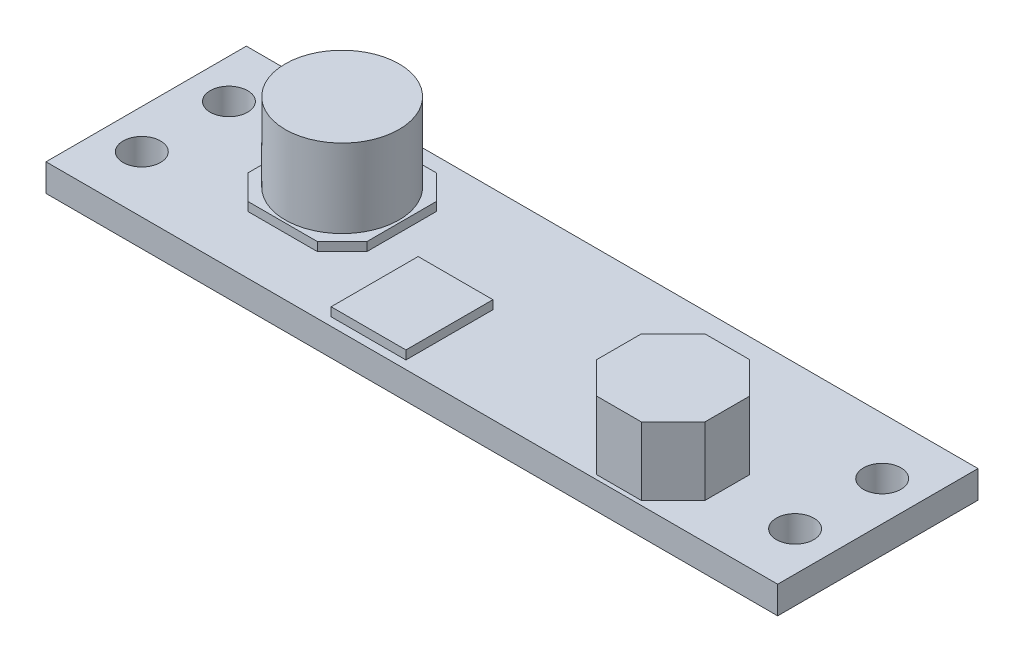
ISO-10303-21;
HEADER;
FILE_DESCRIPTION(('STEP AP214'),'2;1');
FILE_NAME('part.step','',(''),(''),'','','');
FILE_SCHEMA(('AUTOMOTIVE_DESIGN { 1 0 10303 214 1 1 1 1 }'));
ENDSEC;
DATA;
#1=APPLICATION_CONTEXT('core data for automotive mechanical design processes');
#2=APPLICATION_PROTOCOL_DEFINITION('international standard','automotive_design',2000,#1);
#3=PRODUCT_CONTEXT('',#1,'mechanical');
#4=PRODUCT('Part','Part','',(#3));
#5=PRODUCT_RELATED_PRODUCT_CATEGORY('part','',(#4));
#6=PRODUCT_DEFINITION_FORMATION('','',#4);
#7=PRODUCT_DEFINITION_CONTEXT('part definition',#1,'design');
#8=PRODUCT_DEFINITION('design','',#6,#7);
#9=PRODUCT_DEFINITION_SHAPE('','',#8);
#10=(LENGTH_UNIT() NAMED_UNIT(*) SI_UNIT(.MILLI.,.METRE.));
#11=(NAMED_UNIT(*) PLANE_ANGLE_UNIT() SI_UNIT($,.RADIAN.));
#12=(NAMED_UNIT(*) SI_UNIT($,.STERADIAN.) SOLID_ANGLE_UNIT());
#13=UNCERTAINTY_MEASURE_WITH_UNIT(LENGTH_MEASURE(1.E-05),#10,'distance_accuracy_value','');
#14=(GEOMETRIC_REPRESENTATION_CONTEXT(3) GLOBAL_UNCERTAINTY_ASSIGNED_CONTEXT((#13)) GLOBAL_UNIT_ASSIGNED_CONTEXT((#10,
#11,#12)) REPRESENTATION_CONTEXT('',''));
#15=CARTESIAN_POINT('',(0.,0.,0.));
#16=DIRECTION('',(0.,0.,1.));
#17=DIRECTION('',(1.,0.,0.));
#18=AXIS2_PLACEMENT_3D('',#15,#16,#17);
#19=CARTESIAN_POINT('',(21.336,1.6002,-5.842));
#20=DIRECTION('',(0.,-1.,0.));
#21=DIRECTION('',(0.,0.,-1.));
#22=AXIS2_PLACEMENT_3D('',#19,#20,#21);
#23=PLANE('',#22);
#24=DIRECTION('',(0.707106781186548,0.,-0.707106781186547));
#25=VECTOR('',#24,1.);
#26=CARTESIAN_POINT('',(-7.44094847732413,1.6002,1.02877931249168));
#27=LINE('',#26,#25);
#28=CARTESIAN_POINT('',(-8.87778945669519,1.6002,2.46562029186274));
#29=VERTEX_POINT('',#28);
#30=CARTESIAN_POINT('',(-7.44094847732413,1.6002,1.02877931249168));
#31=VERTEX_POINT('',#30);
#32=EDGE_CURVE('E219',#29,#31,#27,.T.);
#33=ORIENTED_EDGE('',*,*,#32,.F.);
#34=DIRECTION('',(1.,0.,0.));
#35=VECTOR('',#34,1.);
#36=CARTESIAN_POINT('',(-8.87778945669519,1.6002,2.46562029186274));
#37=LINE('',#36,#35);
#38=CARTESIAN_POINT('',(-12.9417894566952,1.6002,2.46562029186274));
#39=VERTEX_POINT('',#38);
#40=EDGE_CURVE('E229',#39,#29,#37,.T.);
#41=ORIENTED_EDGE('',*,*,#40,.F.);
#42=DIRECTION('',(0.707106781186548,0.,0.707106781186548));
#43=VECTOR('',#42,1.);
#44=CARTESIAN_POINT('',(-12.9417894566952,1.6002,2.46562029186274));
#45=LINE('',#44,#43);
#46=CARTESIAN_POINT('',(-14.3786304360663,1.6002,1.02877931249169));
#47=VERTEX_POINT('',#46);
#48=EDGE_CURVE('E261',#47,#39,#45,.T.);
#49=ORIENTED_EDGE('',*,*,#48,.F.);
#50=DIRECTION('',(0.,0.,1.));
#51=VECTOR('',#50,1.);
#52=CARTESIAN_POINT('',(-14.3786304360663,1.6002,1.02877931249168));
#53=LINE('',#52,#51);
#54=CARTESIAN_POINT('',(-14.3786304360663,1.6002,-3.03522068750832));
#55=VERTEX_POINT('',#54);
#56=EDGE_CURVE('E258',#55,#47,#53,.T.);
#57=ORIENTED_EDGE('',*,*,#56,.F.);
#58=DIRECTION('',(-0.707106781186548,0.,0.707106781186547));
#59=VECTOR('',#58,1.);
#60=CARTESIAN_POINT('',(-14.3786304360663,1.6002,-3.03522068750832));
#61=LINE('',#60,#59);
#62=CARTESIAN_POINT('',(-12.9417894566952,1.6002,-4.47206166687938));
#63=VERTEX_POINT('',#62);
#64=EDGE_CURVE('E255',#63,#55,#61,.T.);
#65=ORIENTED_EDGE('',*,*,#64,.F.);
#66=DIRECTION('',(-1.,0.,0.));
#67=VECTOR('',#66,1.);
#68=CARTESIAN_POINT('',(-12.9417894566952,1.6002,-4.47206166687939));
#69=LINE('',#68,#67);
#70=CARTESIAN_POINT('',(-8.87778945669519,1.6002,-4.47206166687939));
#71=VERTEX_POINT('',#70);
#72=EDGE_CURVE('E252',#71,#63,#69,.T.);
#73=ORIENTED_EDGE('',*,*,#72,.F.);
#74=DIRECTION('',(-0.707106781186547,0.,-0.707106781186548));
#75=VECTOR('',#74,1.);
#76=CARTESIAN_POINT('',(-7.44094847732413,1.6002,-3.03522068750832));
#77=LINE('',#76,#75);
#78=CARTESIAN_POINT('',(-7.44094847732413,1.6002,-3.03522068750832));
#79=VERTEX_POINT('',#78);
#80=EDGE_CURVE('E249',#79,#71,#77,.T.);
#81=ORIENTED_EDGE('',*,*,#80,.F.);
#82=DIRECTION('',(0.,0.,-1.));
#83=VECTOR('',#82,1.);
#84=CARTESIAN_POINT('',(-7.44094847732413,1.6002,1.02877931249168));
#85=LINE('',#84,#83);
#86=EDGE_CURVE('E246',#31,#79,#85,.T.);
#87=ORIENTED_EDGE('',*,*,#86,.F.);
#88=EDGE_LOOP('',(#33,#41,#49,#57,#65,#73,#81,#87));
#89=FACE_BOUND('',#88,.T.);
#90=CARTESIAN_POINT('',(19.05,1.6002,2.54));
#91=DIRECTION('',(0.,1.,0.));
#92=DIRECTION('',(0.,0.,1.));
#93=AXIS2_PLACEMENT_3D('',#90,#91,#92);
#94=CIRCLE('',#93,1.0922);
#95=CARTESIAN_POINT('',(19.05,1.6002,3.6322));
#96=VERTEX_POINT('',#95);
#97=EDGE_CURVE('E323',#96,#96,#94,.T.);
#98=ORIENTED_EDGE('',*,*,#97,.F.);
#99=EDGE_LOOP('',(#98));
#100=FACE_BOUND('',#99,.T.);
#101=CARTESIAN_POINT('',(-19.05,1.6002,2.54));
#102=DIRECTION('',(0.,1.,0.));
#103=DIRECTION('',(0.,0.,1.));
#104=AXIS2_PLACEMENT_3D('',#101,#102,#103);
#105=CIRCLE('',#104,1.0922);
#106=CARTESIAN_POINT('',(-19.05,1.6002,3.6322));
#107=VERTEX_POINT('',#106);
#108=EDGE_CURVE('E335',#107,#107,#105,.T.);
#109=ORIENTED_EDGE('',*,*,#108,.F.);
#110=EDGE_LOOP('',(#109));
#111=FACE_BOUND('',#110,.T.);
#112=DIRECTION('',(0.,0.,-1.));
#113=VECTOR('',#112,1.);
#114=CARTESIAN_POINT('',(21.336,1.6002,5.842));
#115=LINE('',#114,#113);
#116=CARTESIAN_POINT('',(21.336,1.6002,5.842));
#117=VERTEX_POINT('',#116);
#118=CARTESIAN_POINT('',(21.336,1.6002,-5.842));
#119=VERTEX_POINT('',#118);
#120=EDGE_CURVE('E347',#117,#119,#115,.T.);
#121=ORIENTED_EDGE('',*,*,#120,.T.);
#122=DIRECTION('',(-1.,0.,0.));
#123=VECTOR('',#122,1.);
#124=CARTESIAN_POINT('',(-21.336,1.6002,-5.842));
#125=LINE('',#124,#123);
#126=CARTESIAN_POINT('',(-21.336,1.6002,-5.842));
#127=VERTEX_POINT('',#126);
#128=EDGE_CURVE('E350',#119,#127,#125,.T.);
#129=ORIENTED_EDGE('',*,*,#128,.T.);
#130=DIRECTION('',(0.,0.,1.));
#131=VECTOR('',#130,1.);
#132=CARTESIAN_POINT('',(-21.336,1.6002,5.842));
#133=LINE('',#132,#131);
#134=CARTESIAN_POINT('',(-21.336,1.6002,5.842));
#135=VERTEX_POINT('',#134);
#136=EDGE_CURVE('E353',#127,#135,#133,.T.);
#137=ORIENTED_EDGE('',*,*,#136,.T.);
#138=DIRECTION('',(1.,0.,0.));
#139=VECTOR('',#138,1.);
#140=CARTESIAN_POINT('',(-21.336,1.6002,5.842));
#141=LINE('',#140,#139);
#142=EDGE_CURVE('E355',#135,#117,#141,.T.);
#143=ORIENTED_EDGE('',*,*,#142,.T.);
#144=EDGE_LOOP('',(#121,#129,#137,#143));
#145=FACE_BOUND('',#144,.T.);
#146=CARTESIAN_POINT('',(-19.05,1.6002,-2.54));
#147=DIRECTION('',(0.,1.,0.));
#148=DIRECTION('',(0.,0.,1.));
#149=AXIS2_PLACEMENT_3D('',#146,#147,#148);
#150=CIRCLE('',#149,1.0922);
#151=CARTESIAN_POINT('',(-19.05,1.6002,-1.4478));
#152=VERTEX_POINT('',#151);
#153=EDGE_CURVE('E341',#152,#152,#150,.T.);
#154=ORIENTED_EDGE('',*,*,#153,.F.);
#155=EDGE_LOOP('',(#154));
#156=FACE_BOUND('',#155,.T.);
#157=CARTESIAN_POINT('',(19.05,1.6002,-2.54));
#158=DIRECTION('',(0.,1.,0.));
#159=DIRECTION('',(0.,0.,1.));
#160=AXIS2_PLACEMENT_3D('',#157,#158,#159);
#161=CIRCLE('',#160,1.0922);
#162=CARTESIAN_POINT('',(19.05,1.6002,-1.4478));
#163=VERTEX_POINT('',#162);
#164=EDGE_CURVE('E329',#163,#163,#161,.T.);
#165=ORIENTED_EDGE('',*,*,#164,.F.);
#166=EDGE_LOOP('',(#165));
#167=FACE_BOUND('',#166,.T.);
#168=DIRECTION('',(0.,0.,-1.));
#169=VECTOR('',#168,1.);
#170=CARTESIAN_POINT('',(-0.829899240670784,1.6002,5.35736625431582));
#171=LINE('',#170,#169);
#172=CARTESIAN_POINT('',(-0.829899240670784,1.6002,5.35736625431582));
#173=VERTEX_POINT('',#172);
#174=CARTESIAN_POINT('',(-0.829899240670784,1.6002,0.283124966983905));
#175=VERTEX_POINT('',#174);
#176=EDGE_CURVE('E289',#173,#175,#171,.T.);
#177=ORIENTED_EDGE('',*,*,#176,.F.);
#178=DIRECTION('',(1.,0.,0.));
#179=VECTOR('',#178,1.);
#180=CARTESIAN_POINT('',(-0.829899240670784,1.6002,5.35736625431582));
#181=LINE('',#180,#179);
#182=CARTESIAN_POINT('',(-5.19072849414215,1.6002,5.35736625431582));
#183=VERTEX_POINT('',#182);
#184=EDGE_CURVE('E294',#183,#173,#181,.T.);
#185=ORIENTED_EDGE('',*,*,#184,.F.);
#186=DIRECTION('',(0.,0.,1.));
#187=VECTOR('',#186,1.);
#188=CARTESIAN_POINT('',(-5.19072849414215,1.6002,5.35736625431582));
#189=LINE('',#188,#187);
#190=CARTESIAN_POINT('',(-5.19072849414215,1.6002,0.283124966983905));
#191=VERTEX_POINT('',#190);
#192=EDGE_CURVE('E306',#191,#183,#189,.T.);
#193=ORIENTED_EDGE('',*,*,#192,.F.);
#194=DIRECTION('',(-1.,0.,0.));
#195=VECTOR('',#194,1.);
#196=CARTESIAN_POINT('',(-0.829899240670784,1.6002,0.283124966983905));
#197=LINE('',#196,#195);
#198=EDGE_CURVE('E303',#175,#191,#197,.T.);
#199=ORIENTED_EDGE('',*,*,#198,.F.);
#200=EDGE_LOOP('',(#177,#185,#193,#199));
#201=FACE_BOUND('',#200,.T.);
#202=DIRECTION('',(0.707106781186547,0.,-0.707106781186548));
#203=VECTOR('',#202,1.);
#204=CARTESIAN_POINT('',(13.1403500317624,1.6002,5.58754447328604));
#205=LINE('',#204,#203);
#206=CARTESIAN_POINT('',(13.1403500317624,1.6002,5.58754447328604));
#207=VERTEX_POINT('',#206);
#208=CARTESIAN_POINT('',(14.986,1.6002,3.74189450504848));
#209=VERTEX_POINT('',#208);
#210=EDGE_CURVE('E215',#207,#209,#205,.T.);
#211=ORIENTED_EDGE('',*,*,#210,.F.);
#212=DIRECTION('',(1.,0.,0.));
#213=VECTOR('',#212,1.);
#214=CARTESIAN_POINT('',(10.5302068152874,1.6002,5.58754447328604));
#215=LINE('',#214,#213);
#216=CARTESIAN_POINT('',(10.5302068152874,1.6002,5.58754447328604));
#217=VERTEX_POINT('',#216);
#218=EDGE_CURVE('E212',#217,#207,#215,.T.);
#219=ORIENTED_EDGE('',*,*,#218,.F.);
#220=DIRECTION('',(0.707106781186548,0.,0.707106781186547));
#221=VECTOR('',#220,1.);
#222=CARTESIAN_POINT('',(8.68455684704985,1.6002,3.74189450504848));
#223=LINE('',#222,#221);
#224=CARTESIAN_POINT('',(8.68455684704985,1.6002,3.74189450504848));
#225=VERTEX_POINT('',#224);
#226=EDGE_CURVE('E412',#225,#217,#223,.T.);
#227=ORIENTED_EDGE('',*,*,#226,.F.);
#228=DIRECTION('',(0.,0.,1.));
#229=VECTOR('',#228,1.);
#230=CARTESIAN_POINT('',(8.68455684704985,1.6002,1.13175128857345));
#231=LINE('',#230,#229);
#232=CARTESIAN_POINT('',(8.68455684704985,1.6002,1.13175128857345));
#233=VERTEX_POINT('',#232);
#234=EDGE_CURVE('E446',#233,#225,#231,.T.);
#235=ORIENTED_EDGE('',*,*,#234,.F.);
#236=DIRECTION('',(-0.707106781186547,0.,0.707106781186548));
#237=VECTOR('',#236,1.);
#238=CARTESIAN_POINT('',(10.5302068152874,1.6002,-0.713898679664109));
#239=LINE('',#238,#237);
#240=CARTESIAN_POINT('',(10.5302068152874,1.6002,-0.713898679664109));
#241=VERTEX_POINT('',#240);
#242=EDGE_CURVE('E440',#241,#233,#239,.T.);
#243=ORIENTED_EDGE('',*,*,#242,.F.);
#244=DIRECTION('',(-1.,0.,0.));
#245=VECTOR('',#244,1.);
#246=CARTESIAN_POINT('',(13.1403500317624,1.6002,-0.71389867966411));
#247=LINE('',#246,#245);
#248=CARTESIAN_POINT('',(13.1403500317624,1.6002,-0.71389867966411));
#249=VERTEX_POINT('',#248);
#250=EDGE_CURVE('E435',#249,#241,#247,.T.);
#251=ORIENTED_EDGE('',*,*,#250,.F.);
#252=DIRECTION('',(-0.707106781186548,0.,-0.707106781186547));
#253=VECTOR('',#252,1.);
#254=CARTESIAN_POINT('',(14.986,1.6002,1.13175128857346));
#255=LINE('',#254,#253);
#256=CARTESIAN_POINT('',(14.986,1.6002,1.13175128857346));
#257=VERTEX_POINT('',#256);
#258=EDGE_CURVE('E54',#257,#249,#255,.T.);
#259=ORIENTED_EDGE('',*,*,#258,.F.);
#260=DIRECTION('',(0.,0.,-1.));
#261=VECTOR('',#260,1.);
#262=CARTESIAN_POINT('',(14.986,1.6002,3.74189450504848));
#263=LINE('',#262,#261);
#264=EDGE_CURVE('E49',#209,#257,#263,.T.);
#265=ORIENTED_EDGE('',*,*,#264,.F.);
#266=EDGE_LOOP('',(#211,#219,#227,#235,#243,#251,#259,#265));
#267=FACE_BOUND('',#266,.T.);
#268=ADVANCED_FACE('F34',(#89,#100,#111,#145,#156,#167,#201,#267),#23,.F.);
#269=CARTESIAN_POINT('',(-10.9097894566952,2.1082,4.49762029186274));
#270=DIRECTION('',(0.,-1.,0.));
#271=DIRECTION('',(0.,0.,-1.));
#272=AXIS2_PLACEMENT_3D('',#269,#270,#271);
#273=PLANE('',#272);
#274=DIRECTION('',(0.707106781186548,0.,-0.707106781186547));
#275=VECTOR('',#274,1.);
#276=CARTESIAN_POINT('',(-7.44094847732413,2.1082,1.02877931249168));
#277=LINE('',#276,#275);
#278=CARTESIAN_POINT('',(-8.87778945669519,2.1082,2.46562029186274));
#279=VERTEX_POINT('',#278);
#280=CARTESIAN_POINT('',(-7.44094847732413,2.1082,1.02877931249168));
#281=VERTEX_POINT('',#280);
#282=EDGE_CURVE('E225',#279,#281,#277,.T.);
#283=ORIENTED_EDGE('',*,*,#282,.T.);
#284=DIRECTION('',(0.,0.,-1.));
#285=VECTOR('',#284,1.);
#286=CARTESIAN_POINT('',(-7.44094847732413,2.1082,1.02877931249168));
#287=LINE('',#286,#285);
#288=CARTESIAN_POINT('',(-7.44094847732413,2.1082,-3.03522068750832));
#289=VERTEX_POINT('',#288);
#290=EDGE_CURVE('E228',#281,#289,#287,.T.);
#291=ORIENTED_EDGE('',*,*,#290,.T.);
#292=DIRECTION('',(-0.707106781186547,0.,-0.707106781186548));
#293=VECTOR('',#292,1.);
#294=CARTESIAN_POINT('',(-7.44094847732413,2.1082,-3.03522068750832));
#295=LINE('',#294,#293);
#296=CARTESIAN_POINT('',(-8.87778945669519,2.1082,-4.47206166687939));
#297=VERTEX_POINT('',#296);
#298=EDGE_CURVE('E231',#289,#297,#295,.T.);
#299=ORIENTED_EDGE('',*,*,#298,.T.);
#300=DIRECTION('',(-1.,0.,0.));
#301=VECTOR('',#300,1.);
#302=CARTESIAN_POINT('',(-12.9417894566952,2.1082,-4.47206166687939));
#303=LINE('',#302,#301);
#304=CARTESIAN_POINT('',(-12.9417894566952,2.1082,-4.47206166687939));
#305=VERTEX_POINT('',#304);
#306=EDGE_CURVE('E233',#297,#305,#303,.T.);
#307=ORIENTED_EDGE('',*,*,#306,.T.);
#308=DIRECTION('',(-0.707106781186548,0.,0.707106781186547));
#309=VECTOR('',#308,1.);
#310=CARTESIAN_POINT('',(-14.3786304360663,2.1082,-3.03522068750832));
#311=LINE('',#310,#309);
#312=CARTESIAN_POINT('',(-14.3786304360663,2.1082,-3.03522068750832));
#313=VERTEX_POINT('',#312);
#314=EDGE_CURVE('E235',#305,#313,#311,.T.);
#315=ORIENTED_EDGE('',*,*,#314,.T.);
#316=DIRECTION('',(0.,0.,1.));
#317=VECTOR('',#316,1.);
#318=CARTESIAN_POINT('',(-14.3786304360663,2.1082,1.02877931249168));
#319=LINE('',#318,#317);
#320=CARTESIAN_POINT('',(-14.3786304360663,2.1082,1.02877931249168));
#321=VERTEX_POINT('',#320);
#322=EDGE_CURVE('E237',#313,#321,#319,.T.);
#323=ORIENTED_EDGE('',*,*,#322,.T.);
#324=DIRECTION('',(0.707106781186548,0.,0.707106781186548));
#325=VECTOR('',#324,1.);
#326=CARTESIAN_POINT('',(-12.9417894566952,2.1082,2.46562029186274));
#327=LINE('',#326,#325);
#328=CARTESIAN_POINT('',(-12.9417894566952,2.1082,2.46562029186274));
#329=VERTEX_POINT('',#328);
#330=EDGE_CURVE('E239',#321,#329,#327,.T.);
#331=ORIENTED_EDGE('',*,*,#330,.T.);
#332=DIRECTION('',(1.,0.,0.));
#333=VECTOR('',#332,1.);
#334=CARTESIAN_POINT('',(-8.87778945669519,2.1082,2.46562029186274));
#335=LINE('',#334,#333);
#336=EDGE_CURVE('E241',#329,#279,#335,.T.);
#337=ORIENTED_EDGE('',*,*,#336,.T.);
#338=EDGE_LOOP('',(#283,#291,#299,#307,#315,#323,#331,#337));
#339=FACE_BOUND('',#338,.T.);
#340=CARTESIAN_POINT('',(-10.9097894566952,2.1082,-1.00322068750832));
#341=DIRECTION('',(0.,-1.,0.));
#342=DIRECTION('',(0.,0.,-1.));
#343=AXIS2_PLACEMENT_3D('',#340,#341,#342);
#344=CIRCLE('',#343,3.31832506713628);
#345=CARTESIAN_POINT('',(-10.9097894566952,2.1082,-4.3215457546446));
#346=VERTEX_POINT('',#345);
#347=EDGE_CURVE('E11',#346,#346,#344,.F.);
#348=ORIENTED_EDGE('',*,*,#347,.F.);
#349=EDGE_LOOP('',(#348));
#350=FACE_BOUND('',#349,.T.);
#351=ADVANCED_FACE('F396',(#339,#350),#273,.F.);
#352=CARTESIAN_POINT('',(21.336,0.,-5.842));
#353=DIRECTION('',(0.,-1.,0.));
#354=DIRECTION('',(0.,0.,-1.));
#355=AXIS2_PLACEMENT_3D('',#352,#353,#354);
#356=PLANE('',#355);
#357=CARTESIAN_POINT('',(19.05,0.,-2.54));
#358=DIRECTION('',(0.,1.,0.));
#359=DIRECTION('',(0.,0.,1.));
#360=AXIS2_PLACEMENT_3D('',#357,#358,#359);
#361=CIRCLE('',#360,1.0922);
#362=CARTESIAN_POINT('',(19.05,0.,-1.4478));
#363=VERTEX_POINT('',#362);
#364=EDGE_CURVE('E326',#363,#363,#361,.T.);
#365=ORIENTED_EDGE('',*,*,#364,.T.);
#366=EDGE_LOOP('',(#365));
#367=FACE_BOUND('',#366,.T.);
#368=CARTESIAN_POINT('',(-19.05,0.,-2.54));
#369=DIRECTION('',(0.,1.,0.));
#370=DIRECTION('',(0.,0.,1.));
#371=AXIS2_PLACEMENT_3D('',#368,#369,#370);
#372=CIRCLE('',#371,1.0922);
#373=CARTESIAN_POINT('',(-19.05,0.,-1.4478));
#374=VERTEX_POINT('',#373);
#375=EDGE_CURVE('E338',#374,#374,#372,.T.);
#376=ORIENTED_EDGE('',*,*,#375,.T.);
#377=EDGE_LOOP('',(#376));
#378=FACE_BOUND('',#377,.T.);
#379=DIRECTION('',(0.,0.,-1.));
#380=VECTOR('',#379,1.);
#381=CARTESIAN_POINT('',(21.336,0.,5.842));
#382=LINE('',#381,#380);
#383=CARTESIAN_POINT('',(21.336,0.,5.842));
#384=VERTEX_POINT('',#383);
#385=CARTESIAN_POINT('',(21.336,0.,-5.842));
#386=VERTEX_POINT('',#385);
#387=EDGE_CURVE('E344',#384,#386,#382,.T.);
#388=ORIENTED_EDGE('',*,*,#387,.F.);
#389=DIRECTION('',(1.,0.,0.));
#390=VECTOR('',#389,1.);
#391=CARTESIAN_POINT('',(-21.336,0.,5.842));
#392=LINE('',#391,#390);
#393=CARTESIAN_POINT('',(-21.336,0.,5.842));
#394=VERTEX_POINT('',#393);
#395=EDGE_CURVE('E351',#394,#384,#392,.T.);
#396=ORIENTED_EDGE('',*,*,#395,.F.);
#397=DIRECTION('',(0.,0.,1.));
#398=VECTOR('',#397,1.);
#399=CARTESIAN_POINT('',(-21.336,0.,5.842));
#400=LINE('',#399,#398);
#401=CARTESIAN_POINT('',(-21.336,0.,-5.842));
#402=VERTEX_POINT('',#401);
#403=EDGE_CURVE('E362',#402,#394,#400,.T.);
#404=ORIENTED_EDGE('',*,*,#403,.F.);
#405=DIRECTION('',(-1.,0.,0.));
#406=VECTOR('',#405,1.);
#407=CARTESIAN_POINT('',(-21.336,0.,-5.842));
#408=LINE('',#407,#406);
#409=EDGE_CURVE('E360',#386,#402,#408,.T.);
#410=ORIENTED_EDGE('',*,*,#409,.F.);
#411=EDGE_LOOP('',(#388,#396,#404,#410));
#412=FACE_BOUND('',#411,.T.);
#413=CARTESIAN_POINT('',(-19.05,0.,2.54));
#414=DIRECTION('',(0.,1.,0.));
#415=DIRECTION('',(0.,0.,1.));
#416=AXIS2_PLACEMENT_3D('',#413,#414,#415);
#417=CIRCLE('',#416,1.0922);
#418=CARTESIAN_POINT('',(-19.05,0.,3.6322));
#419=VERTEX_POINT('',#418);
#420=EDGE_CURVE('E332',#419,#419,#417,.T.);
#421=ORIENTED_EDGE('',*,*,#420,.T.);
#422=EDGE_LOOP('',(#421));
#423=FACE_BOUND('',#422,.T.);
#424=CARTESIAN_POINT('',(19.05,0.,2.54));
#425=DIRECTION('',(0.,1.,0.));
#426=DIRECTION('',(0.,0.,1.));
#427=AXIS2_PLACEMENT_3D('',#424,#425,#426);
#428=CIRCLE('',#427,1.0922);
#429=CARTESIAN_POINT('',(19.05,0.,3.6322));
#430=VERTEX_POINT('',#429);
#431=EDGE_CURVE('E322',#430,#430,#428,.T.);
#432=ORIENTED_EDGE('',*,*,#431,.T.);
#433=EDGE_LOOP('',(#432));
#434=FACE_BOUND('',#433,.T.);
#435=ADVANCED_FACE('F383',(#367,#378,#412,#423,#434),#356,.T.);
#436=CARTESIAN_POINT('',(21.336,1.6002,5.842));
#437=DIRECTION('',(-1.,0.,0.));
#438=DIRECTION('',(0.,0.,1.));
#439=AXIS2_PLACEMENT_3D('',#436,#437,#438);
#440=PLANE('',#439);
#441=ORIENTED_EDGE('',*,*,#387,.T.);
#442=DIRECTION('',(0.,-1.,0.));
#443=VECTOR('',#442,1.);
#444=CARTESIAN_POINT('',(21.336,1.6002,-5.842));
#445=LINE('',#444,#443);
#446=EDGE_CURVE('E42',#119,#386,#445,.T.);
#447=ORIENTED_EDGE('',*,*,#446,.F.);
#448=ORIENTED_EDGE('',*,*,#120,.F.);
#449=DIRECTION('',(0.,-1.,0.));
#450=VECTOR('',#449,1.);
#451=CARTESIAN_POINT('',(21.336,1.6002,5.842));
#452=LINE('',#451,#450);
#453=EDGE_CURVE('E357',#117,#384,#452,.T.);
#454=ORIENTED_EDGE('',*,*,#453,.T.);
#455=EDGE_LOOP('',(#441,#447,#448,#454));
#456=FACE_BOUND('',#455,.T.);
#457=ADVANCED_FACE('F36',(#456),#440,.F.);
#458=CARTESIAN_POINT('',(-21.336,1.6002,-5.842));
#459=DIRECTION('',(0.,0.,1.));
#460=DIRECTION('',(1.,0.,0.));
#461=AXIS2_PLACEMENT_3D('',#458,#459,#460);
#462=PLANE('',#461);
#463=ORIENTED_EDGE('',*,*,#409,.T.);
#464=DIRECTION('',(0.,-1.,0.));
#465=VECTOR('',#464,1.);
#466=CARTESIAN_POINT('',(-21.336,1.6002,-5.842));
#467=LINE('',#466,#465);
#468=EDGE_CURVE('E370',#127,#402,#467,.T.);
#469=ORIENTED_EDGE('',*,*,#468,.F.);
#470=ORIENTED_EDGE('',*,*,#128,.F.);
#471=ORIENTED_EDGE('',*,*,#446,.T.);
#472=EDGE_LOOP('',(#463,#469,#470,#471));
#473=FACE_BOUND('',#472,.T.);
#474=ADVANCED_FACE('F375',(#473),#462,.F.);
#475=CARTESIAN_POINT('',(-21.336,1.6002,5.842));
#476=DIRECTION('',(1.,0.,0.));
#477=DIRECTION('',(0.,0.,-1.));
#478=AXIS2_PLACEMENT_3D('',#475,#476,#477);
#479=PLANE('',#478);
#480=ORIENTED_EDGE('',*,*,#403,.T.);
#481=DIRECTION('',(0.,-1.,0.));
#482=VECTOR('',#481,1.);
#483=CARTESIAN_POINT('',(-21.336,1.6002,5.842));
#484=LINE('',#483,#482);
#485=EDGE_CURVE('E367',#135,#394,#484,.T.);
#486=ORIENTED_EDGE('',*,*,#485,.F.);
#487=ORIENTED_EDGE('',*,*,#136,.F.);
#488=ORIENTED_EDGE('',*,*,#468,.T.);
#489=EDGE_LOOP('',(#480,#486,#487,#488));
#490=FACE_BOUND('',#489,.T.);
#491=ADVANCED_FACE('F388',(#490),#479,.F.);
#492=CARTESIAN_POINT('',(-21.336,1.6002,5.842));
#493=DIRECTION('',(0.,0.,-1.));
#494=DIRECTION('',(-1.,0.,0.));
#495=AXIS2_PLACEMENT_3D('',#492,#493,#494);
#496=PLANE('',#495);
#497=ORIENTED_EDGE('',*,*,#395,.T.);
#498=ORIENTED_EDGE('',*,*,#453,.F.);
#499=ORIENTED_EDGE('',*,*,#142,.F.);
#500=ORIENTED_EDGE('',*,*,#485,.T.);
#501=EDGE_LOOP('',(#497,#498,#499,#500));
#502=FACE_BOUND('',#501,.T.);
#503=ADVANCED_FACE('F392',(#502),#496,.F.);
#504=CARTESIAN_POINT('',(-19.05,1.6002,-2.54));
#505=DIRECTION('',(0.,-1.,0.));
#506=DIRECTION('',(0.,0.,-1.));
#507=AXIS2_PLACEMENT_3D('',#504,#505,#506);
#508=CYLINDRICAL_SURFACE('',#507,1.0922);
#509=ORIENTED_EDGE('',*,*,#153,.T.);
#510=EDGE_LOOP('',(#509));
#511=FACE_BOUND('',#510,.T.);
#512=ORIENTED_EDGE('',*,*,#375,.F.);
#513=EDGE_LOOP('',(#512));
#514=FACE_BOUND('',#513,.T.);
#515=ADVANCED_FACE('F556',(#511,#514),#508,.F.);
#516=CARTESIAN_POINT('',(-19.05,1.6002,2.54));
#517=DIRECTION('',(0.,-1.,0.));
#518=DIRECTION('',(0.,0.,-1.));
#519=AXIS2_PLACEMENT_3D('',#516,#517,#518);
#520=CYLINDRICAL_SURFACE('',#519,1.0922);
#521=ORIENTED_EDGE('',*,*,#108,.T.);
#522=EDGE_LOOP('',(#521));
#523=FACE_BOUND('',#522,.T.);
#524=ORIENTED_EDGE('',*,*,#420,.F.);
#525=EDGE_LOOP('',(#524));
#526=FACE_BOUND('',#525,.T.);
#527=ADVANCED_FACE('F552',(#523,#526),#520,.F.);
#528=CARTESIAN_POINT('',(19.05,1.6002,-2.54));
#529=DIRECTION('',(0.,-1.,0.));
#530=DIRECTION('',(0.,0.,-1.));
#531=AXIS2_PLACEMENT_3D('',#528,#529,#530);
#532=CYLINDRICAL_SURFACE('',#531,1.0922);
#533=ORIENTED_EDGE('',*,*,#164,.T.);
#534=EDGE_LOOP('',(#533));
#535=FACE_BOUND('',#534,.T.);
#536=ORIENTED_EDGE('',*,*,#364,.F.);
#537=EDGE_LOOP('',(#536));
#538=FACE_BOUND('',#537,.T.);
#539=ADVANCED_FACE('F548',(#535,#538),#532,.F.);
#540=CARTESIAN_POINT('',(19.05,1.6002,2.54));
#541=DIRECTION('',(0.,-1.,0.));
#542=DIRECTION('',(0.,0.,-1.));
#543=AXIS2_PLACEMENT_3D('',#540,#541,#542);
#544=CYLINDRICAL_SURFACE('',#543,1.0922);
#545=ORIENTED_EDGE('',*,*,#97,.T.);
#546=EDGE_LOOP('',(#545));
#547=FACE_BOUND('',#546,.T.);
#548=ORIENTED_EDGE('',*,*,#431,.F.);
#549=EDGE_LOOP('',(#548));
#550=FACE_BOUND('',#549,.T.);
#551=ADVANCED_FACE('F544',(#547,#550),#544,.F.);
#552=CARTESIAN_POINT('',(-0.829899240670784,2.1082,5.35736625431582));
#553=DIRECTION('',(-1.,0.,0.));
#554=DIRECTION('',(0.,0.,1.));
#555=AXIS2_PLACEMENT_3D('',#552,#553,#554);
#556=PLANE('',#555);
#557=ORIENTED_EDGE('',*,*,#176,.T.);
#558=DIRECTION('',(0.,-1.,0.));
#559=VECTOR('',#558,1.);
#560=CARTESIAN_POINT('',(-0.829899240670784,2.1082,0.283124966983905));
#561=LINE('',#560,#559);
#562=CARTESIAN_POINT('',(-0.829899240670784,2.1082,0.283124966983905));
#563=VERTEX_POINT('',#562);
#564=EDGE_CURVE('E319',#563,#175,#561,.T.);
#565=ORIENTED_EDGE('',*,*,#564,.F.);
#566=DIRECTION('',(0.,0.,-1.));
#567=VECTOR('',#566,1.);
#568=CARTESIAN_POINT('',(-0.829899240670784,2.1082,5.35736625431582));
#569=LINE('',#568,#567);
#570=CARTESIAN_POINT('',(-0.829899240670784,2.1082,5.35736625431582));
#571=VERTEX_POINT('',#570);
#572=EDGE_CURVE('E290',#571,#563,#569,.T.);
#573=ORIENTED_EDGE('',*,*,#572,.F.);
#574=DIRECTION('',(0.,-1.,0.));
#575=VECTOR('',#574,1.);
#576=CARTESIAN_POINT('',(-0.829899240670784,2.1082,5.35736625431582));
#577=LINE('',#576,#575);
#578=EDGE_CURVE('E300',#571,#173,#577,.T.);
#579=ORIENTED_EDGE('',*,*,#578,.T.);
#580=EDGE_LOOP('',(#557,#565,#573,#579));
#581=FACE_BOUND('',#580,.T.);
#582=ADVANCED_FACE('F540',(#581),#556,.F.);
#583=CARTESIAN_POINT('',(-0.829899240670784,2.1082,0.283124966983905));
#584=DIRECTION('',(0.,0.,1.));
#585=DIRECTION('',(1.,0.,0.));
#586=AXIS2_PLACEMENT_3D('',#583,#584,#585);
#587=PLANE('',#586);
#588=ORIENTED_EDGE('',*,*,#198,.T.);
#589=DIRECTION('',(0.,-1.,0.));
#590=VECTOR('',#589,1.);
#591=CARTESIAN_POINT('',(-5.19072849414215,2.1082,0.283124966983905));
#592=LINE('',#591,#590);
#593=CARTESIAN_POINT('',(-5.19072849414215,2.1082,0.283124966983905));
#594=VERTEX_POINT('',#593);
#595=EDGE_CURVE('E316',#594,#191,#592,.T.);
#596=ORIENTED_EDGE('',*,*,#595,.F.);
#597=DIRECTION('',(-1.,0.,0.));
#598=VECTOR('',#597,1.);
#599=CARTESIAN_POINT('',(-0.829899240670784,2.1082,0.283124966983905));
#600=LINE('',#599,#598);
#601=EDGE_CURVE('E293',#563,#594,#600,.T.);
#602=ORIENTED_EDGE('',*,*,#601,.F.);
#603=ORIENTED_EDGE('',*,*,#564,.T.);
#604=EDGE_LOOP('',(#588,#596,#602,#603));
#605=FACE_BOUND('',#604,.T.);
#606=ADVANCED_FACE('F536',(#605),#587,.F.);
#607=CARTESIAN_POINT('',(-5.19072849414215,2.1082,5.35736625431582));
#608=DIRECTION('',(1.,0.,0.));
#609=DIRECTION('',(0.,0.,-1.));
#610=AXIS2_PLACEMENT_3D('',#607,#608,#609);
#611=PLANE('',#610);
#612=ORIENTED_EDGE('',*,*,#192,.T.);
#613=DIRECTION('',(0.,-1.,0.));
#614=VECTOR('',#613,1.);
#615=CARTESIAN_POINT('',(-5.19072849414215,2.1082,5.35736625431582));
#616=LINE('',#615,#614);
#617=CARTESIAN_POINT('',(-5.19072849414215,2.1082,5.35736625431582));
#618=VERTEX_POINT('',#617);
#619=EDGE_CURVE('E313',#618,#183,#616,.T.);
#620=ORIENTED_EDGE('',*,*,#619,.F.);
#621=DIRECTION('',(0.,0.,1.));
#622=VECTOR('',#621,1.);
#623=CARTESIAN_POINT('',(-5.19072849414215,2.1082,5.35736625431582));
#624=LINE('',#623,#622);
#625=EDGE_CURVE('E296',#594,#618,#624,.T.);
#626=ORIENTED_EDGE('',*,*,#625,.F.);
#627=ORIENTED_EDGE('',*,*,#595,.T.);
#628=EDGE_LOOP('',(#612,#620,#626,#627));
#629=FACE_BOUND('',#628,.T.);
#630=ADVANCED_FACE('F532',(#629),#611,.F.);
#631=CARTESIAN_POINT('',(-0.829899240670784,2.1082,5.35736625431582));
#632=DIRECTION('',(0.,0.,-1.));
#633=DIRECTION('',(-1.,0.,0.));
#634=AXIS2_PLACEMENT_3D('',#631,#632,#633);
#635=PLANE('',#634);
#636=ORIENTED_EDGE('',*,*,#184,.T.);
#637=ORIENTED_EDGE('',*,*,#578,.F.);
#638=DIRECTION('',(1.,0.,0.));
#639=VECTOR('',#638,1.);
#640=CARTESIAN_POINT('',(-0.829899240670784,2.1082,5.35736625431582));
#641=LINE('',#640,#639);
#642=EDGE_CURVE('E298',#618,#571,#641,.T.);
#643=ORIENTED_EDGE('',*,*,#642,.F.);
#644=ORIENTED_EDGE('',*,*,#619,.T.);
#645=EDGE_LOOP('',(#636,#637,#643,#644));
#646=FACE_BOUND('',#645,.T.);
#647=ADVANCED_FACE('F528',(#646),#635,.F.);
#648=CARTESIAN_POINT('',(-0.829899240670784,2.1082,0.283124966983905));
#649=DIRECTION('',(0.,1.,0.));
#650=DIRECTION('',(0.,0.,1.));
#651=AXIS2_PLACEMENT_3D('',#648,#649,#650);
#652=PLANE('',#651);
#653=ORIENTED_EDGE('',*,*,#572,.T.);
#654=ORIENTED_EDGE('',*,*,#601,.T.);
#655=ORIENTED_EDGE('',*,*,#625,.T.);
#656=ORIENTED_EDGE('',*,*,#642,.T.);
#657=EDGE_LOOP('',(#653,#654,#655,#656));
#658=FACE_BOUND('',#657,.T.);
#659=ADVANCED_FACE('F524',(#658),#652,.T.);
#660=CARTESIAN_POINT('',(-7.44094847732413,2.1082,1.02877931249168));
#661=DIRECTION('',(-0.707106781186547,0.,-0.707106781186548));
#662=DIRECTION('',(-0.707106781186548,0.,0.707106781186547));
#663=AXIS2_PLACEMENT_3D('',#660,#661,#662);
#664=PLANE('',#663);
#665=ORIENTED_EDGE('',*,*,#32,.T.);
#666=DIRECTION('',(0.,-1.,0.));
#667=VECTOR('',#666,1.);
#668=CARTESIAN_POINT('',(-7.44094847732413,2.1082,1.02877931249168));
#669=LINE('',#668,#667);
#670=EDGE_CURVE('E286',#281,#31,#669,.T.);
#671=ORIENTED_EDGE('',*,*,#670,.F.);
#672=ORIENTED_EDGE('',*,*,#282,.F.);
#673=DIRECTION('',(0.,-1.,0.));
#674=VECTOR('',#673,1.);
#675=CARTESIAN_POINT('',(-8.87778945669519,2.1082,2.46562029186274));
#676=LINE('',#675,#674);
#677=EDGE_CURVE('E243',#279,#29,#676,.T.);
#678=ORIENTED_EDGE('',*,*,#677,.T.);
#679=EDGE_LOOP('',(#665,#671,#672,#678));
#680=FACE_BOUND('',#679,.T.);
#681=ADVANCED_FACE('F520',(#680),#664,.F.);
#682=CARTESIAN_POINT('',(-7.44094847732413,2.1082,1.02877931249168));
#683=DIRECTION('',(-1.,0.,0.));
#684=DIRECTION('',(0.,0.,1.));
#685=AXIS2_PLACEMENT_3D('',#682,#683,#684);
#686=PLANE('',#685);
#687=ORIENTED_EDGE('',*,*,#86,.T.);
#688=DIRECTION('',(0.,-1.,0.));
#689=VECTOR('',#688,1.);
#690=CARTESIAN_POINT('',(-7.44094847732413,2.1082,-3.03522068750832));
#691=LINE('',#690,#689);
#692=EDGE_CURVE('E283',#289,#79,#691,.T.);
#693=ORIENTED_EDGE('',*,*,#692,.F.);
#694=ORIENTED_EDGE('',*,*,#290,.F.);
#695=ORIENTED_EDGE('',*,*,#670,.T.);
#696=EDGE_LOOP('',(#687,#693,#694,#695));
#697=FACE_BOUND('',#696,.T.);
#698=ADVANCED_FACE('F516',(#697),#686,.F.);
#699=CARTESIAN_POINT('',(-7.44094847732413,2.1082,-3.03522068750832));
#700=DIRECTION('',(-0.707106781186548,0.,0.707106781186547));
#701=DIRECTION('',(0.707106781186547,0.,0.707106781186548));
#702=AXIS2_PLACEMENT_3D('',#699,#700,#701);
#703=PLANE('',#702);
#704=ORIENTED_EDGE('',*,*,#80,.T.);
#705=DIRECTION('',(0.,-1.,0.));
#706=VECTOR('',#705,1.);
#707=CARTESIAN_POINT('',(-8.87778945669519,2.1082,-4.47206166687939));
#708=LINE('',#707,#706);
#709=EDGE_CURVE('E280',#297,#71,#708,.T.);
#710=ORIENTED_EDGE('',*,*,#709,.F.);
#711=ORIENTED_EDGE('',*,*,#298,.F.);
#712=ORIENTED_EDGE('',*,*,#692,.T.);
#713=EDGE_LOOP('',(#704,#710,#711,#712));
#714=FACE_BOUND('',#713,.T.);
#715=ADVANCED_FACE('F512',(#714),#703,.F.);
#716=CARTESIAN_POINT('',(-12.9417894566952,2.1082,-4.47206166687939));
#717=DIRECTION('',(0.,0.,1.));
#718=DIRECTION('',(1.,0.,0.));
#719=AXIS2_PLACEMENT_3D('',#716,#717,#718);
#720=PLANE('',#719);
#721=ORIENTED_EDGE('',*,*,#72,.T.);
#722=DIRECTION('',(0.,-1.,0.));
#723=VECTOR('',#722,1.);
#724=CARTESIAN_POINT('',(-12.9417894566952,2.1082,-4.47206166687939));
#725=LINE('',#724,#723);
#726=EDGE_CURVE('E277',#305,#63,#725,.T.);
#727=ORIENTED_EDGE('',*,*,#726,.F.);
#728=ORIENTED_EDGE('',*,*,#306,.F.);
#729=ORIENTED_EDGE('',*,*,#709,.T.);
#730=EDGE_LOOP('',(#721,#727,#728,#729));
#731=FACE_BOUND('',#730,.T.);
#732=ADVANCED_FACE('F508',(#731),#720,.F.);
#733=CARTESIAN_POINT('',(-14.3786304360663,2.1082,-3.03522068750832));
#734=DIRECTION('',(0.707106781186547,0.,0.707106781186548));
#735=DIRECTION('',(0.707106781186548,0.,-0.707106781186547));
#736=AXIS2_PLACEMENT_3D('',#733,#734,#735);
#737=PLANE('',#736);
#738=ORIENTED_EDGE('',*,*,#64,.T.);
#739=DIRECTION('',(0.,-1.,0.));
#740=VECTOR('',#739,1.);
#741=CARTESIAN_POINT('',(-14.3786304360663,2.1082,-3.03522068750832));
#742=LINE('',#741,#740);
#743=EDGE_CURVE('E274',#313,#55,#742,.T.);
#744=ORIENTED_EDGE('',*,*,#743,.F.);
#745=ORIENTED_EDGE('',*,*,#314,.F.);
#746=ORIENTED_EDGE('',*,*,#726,.T.);
#747=EDGE_LOOP('',(#738,#744,#745,#746));
#748=FACE_BOUND('',#747,.T.);
#749=ADVANCED_FACE('F504',(#748),#737,.F.);
#750=CARTESIAN_POINT('',(-14.3786304360663,2.1082,1.02877931249168));
#751=DIRECTION('',(1.,0.,0.));
#752=DIRECTION('',(0.,0.,-1.));
#753=AXIS2_PLACEMENT_3D('',#750,#751,#752);
#754=PLANE('',#753);
#755=ORIENTED_EDGE('',*,*,#56,.T.);
#756=DIRECTION('',(0.,-1.,0.));
#757=VECTOR('',#756,1.);
#758=CARTESIAN_POINT('',(-14.3786304360663,2.1082,1.02877931249168));
#759=LINE('',#758,#757);
#760=EDGE_CURVE('E271',#321,#47,#759,.T.);
#761=ORIENTED_EDGE('',*,*,#760,.F.);
#762=ORIENTED_EDGE('',*,*,#322,.F.);
#763=ORIENTED_EDGE('',*,*,#743,.T.);
#764=EDGE_LOOP('',(#755,#761,#762,#763));
#765=FACE_BOUND('',#764,.T.);
#766=ADVANCED_FACE('F500',(#765),#754,.F.);
#767=CARTESIAN_POINT('',(-12.9417894566952,2.1082,2.46562029186274));
#768=DIRECTION('',(0.707106781186548,0.,-0.707106781186548));
#769=DIRECTION('',(-0.707106781186548,0.,-0.707106781186548));
#770=AXIS2_PLACEMENT_3D('',#767,#768,#769);
#771=PLANE('',#770);
#772=ORIENTED_EDGE('',*,*,#48,.T.);
#773=DIRECTION('',(0.,-1.,0.));
#774=VECTOR('',#773,1.);
#775=CARTESIAN_POINT('',(-12.9417894566952,2.1082,2.46562029186274));
#776=LINE('',#775,#774);
#777=EDGE_CURVE('E268',#329,#39,#776,.T.);
#778=ORIENTED_EDGE('',*,*,#777,.F.);
#779=ORIENTED_EDGE('',*,*,#330,.F.);
#780=ORIENTED_EDGE('',*,*,#760,.T.);
#781=EDGE_LOOP('',(#772,#778,#779,#780));
#782=FACE_BOUND('',#781,.T.);
#783=ADVANCED_FACE('F496',(#782),#771,.F.);
#784=CARTESIAN_POINT('',(-8.87778945669519,2.1082,2.46562029186274));
#785=DIRECTION('',(0.,0.,-1.));
#786=DIRECTION('',(-1.,0.,0.));
#787=AXIS2_PLACEMENT_3D('',#784,#785,#786);
#788=PLANE('',#787);
#789=ORIENTED_EDGE('',*,*,#40,.T.);
#790=ORIENTED_EDGE('',*,*,#677,.F.);
#791=ORIENTED_EDGE('',*,*,#336,.F.);
#792=ORIENTED_EDGE('',*,*,#777,.T.);
#793=EDGE_LOOP('',(#789,#790,#791,#792));
#794=FACE_BOUND('',#793,.T.);
#795=ADVANCED_FACE('F489',(#794),#788,.F.);
#796=CARTESIAN_POINT('',(-10.9097894566952,6.6802,-1.00322068750832));
#797=DIRECTION('',(0.,-1.,0.));
#798=DIRECTION('',(0.,0.,-1.));
#799=AXIS2_PLACEMENT_3D('',#796,#797,#798);
#800=CYLINDRICAL_SURFACE('',#799,3.31832506713628);
#801=CARTESIAN_POINT('',(-10.9097894566952,6.6802,-1.00322068750832));
#802=DIRECTION('',(0.,1.,0.));
#803=DIRECTION('',(0.,0.,1.));
#804=AXIS2_PLACEMENT_3D('',#801,#802,#803);
#805=CIRCLE('',#804,3.31832506713628);
#806=CARTESIAN_POINT('',(-10.9097894566952,6.6802,2.31510437962796));
#807=VERTEX_POINT('',#806);
#808=EDGE_CURVE('E216',#807,#807,#805,.T.);
#809=ORIENTED_EDGE('',*,*,#808,.F.);
#810=EDGE_LOOP('',(#809));
#811=FACE_BOUND('',#810,.T.);
#812=ORIENTED_EDGE('',*,*,#347,.T.);
#813=EDGE_LOOP('',(#812));
#814=FACE_BOUND('',#813,.T.);
#815=ADVANCED_FACE('F485',(#811,#814),#800,.T.);
#816=CARTESIAN_POINT('',(-10.9097894566952,6.6802,-1.00322068750832));
#817=DIRECTION('',(0.,1.,0.));
#818=DIRECTION('',(0.,0.,1.));
#819=AXIS2_PLACEMENT_3D('',#816,#817,#818);
#820=PLANE('',#819);
#821=ORIENTED_EDGE('',*,*,#808,.T.);
#822=EDGE_LOOP('',(#821));
#823=FACE_BOUND('',#822,.T.);
#824=ADVANCED_FACE('F482',(#823),#820,.T.);
#825=CARTESIAN_POINT('',(13.1403500317624,5.56895,5.58754447328604));
#826=DIRECTION('',(-0.707106781186548,0.,-0.707106781186547));
#827=DIRECTION('',(-0.707106781186547,0.,0.707106781186548));
#828=AXIS2_PLACEMENT_3D('',#825,#826,#827);
#829=PLANE('',#828);
#830=ORIENTED_EDGE('',*,*,#210,.T.);
#831=DIRECTION('',(0.,-1.,0.));
#832=VECTOR('',#831,1.);
#833=CARTESIAN_POINT('',(14.986,5.56895,3.74189450504848));
#834=LINE('',#833,#832);
#835=CARTESIAN_POINT('',(14.986,5.56895,3.74189450504848));
#836=VERTEX_POINT('',#835);
#837=EDGE_CURVE('E196',#836,#209,#834,.T.);
#838=ORIENTED_EDGE('',*,*,#837,.F.);
#839=DIRECTION('',(0.707106781186547,0.,-0.707106781186548));
#840=VECTOR('',#839,1.);
#841=CARTESIAN_POINT('',(13.1403500317624,5.56895,5.58754447328604));
#842=LINE('',#841,#840);
#843=CARTESIAN_POINT('',(13.1403500317624,5.56895,5.58754447328604));
#844=VERTEX_POINT('',#843);
#845=EDGE_CURVE('E203',#844,#836,#842,.T.);
#846=ORIENTED_EDGE('',*,*,#845,.F.);
#847=DIRECTION('',(0.,-1.,0.));
#848=VECTOR('',#847,1.);
#849=CARTESIAN_POINT('',(13.1403500317624,5.56895,5.58754447328604));
#850=LINE('',#849,#848);
#851=EDGE_CURVE('E409',#844,#207,#850,.T.);
#852=ORIENTED_EDGE('',*,*,#851,.T.);
#853=EDGE_LOOP('',(#830,#838,#846,#852));
#854=FACE_BOUND('',#853,.T.);
#855=ADVANCED_FACE('F214',(#854),#829,.F.);
#856=CARTESIAN_POINT('',(14.986,5.56895,3.74189450504848));
#857=DIRECTION('',(-1.,0.,0.));
#858=DIRECTION('',(0.,0.,1.));
#859=AXIS2_PLACEMENT_3D('',#856,#857,#858);
#860=PLANE('',#859);
#861=ORIENTED_EDGE('',*,*,#264,.T.);
#862=DIRECTION('',(0.,-1.,0.));
#863=VECTOR('',#862,1.);
#864=CARTESIAN_POINT('',(14.986,5.56895,1.13175128857346));
#865=LINE('',#864,#863);
#866=CARTESIAN_POINT('',(14.986,5.56895,1.13175128857346));
#867=VERTEX_POINT('',#866);
#868=EDGE_CURVE('E199',#867,#257,#865,.T.);
#869=ORIENTED_EDGE('',*,*,#868,.F.);
#870=DIRECTION('',(0.,0.,-1.));
#871=VECTOR('',#870,1.);
#872=CARTESIAN_POINT('',(14.986,5.56895,3.74189450504848));
#873=LINE('',#872,#871);
#874=EDGE_CURVE('E192',#836,#867,#873,.T.);
#875=ORIENTED_EDGE('',*,*,#874,.F.);
#876=ORIENTED_EDGE('',*,*,#837,.T.);
#877=EDGE_LOOP('',(#861,#869,#875,#876));
#878=FACE_BOUND('',#877,.T.);
#879=ADVANCED_FACE('F194',(#878),#860,.F.);
#880=CARTESIAN_POINT('',(14.986,5.56895,1.13175128857346));
#881=DIRECTION('',(-0.707106781186547,0.,0.707106781186548));
#882=DIRECTION('',(0.707106781186548,0.,0.707106781186547));
#883=AXIS2_PLACEMENT_3D('',#880,#881,#882);
#884=PLANE('',#883);
#885=ORIENTED_EDGE('',*,*,#258,.T.);
#886=DIRECTION('',(0.,-1.,0.));
#887=VECTOR('',#886,1.);
#888=CARTESIAN_POINT('',(13.1403500317624,5.56895,-0.71389867966411));
#889=LINE('',#888,#887);
#890=CARTESIAN_POINT('',(13.1403500317624,5.56895,-0.71389867966411));
#891=VERTEX_POINT('',#890);
#892=EDGE_CURVE('E221',#891,#249,#889,.T.);
#893=ORIENTED_EDGE('',*,*,#892,.F.);
#894=DIRECTION('',(-0.707106781186548,0.,-0.707106781186547));
#895=VECTOR('',#894,1.);
#896=CARTESIAN_POINT('',(14.986,5.56895,1.13175128857346));
#897=LINE('',#896,#895);
#898=EDGE_CURVE('E202',#867,#891,#897,.T.);
#899=ORIENTED_EDGE('',*,*,#898,.F.);
#900=ORIENTED_EDGE('',*,*,#868,.T.);
#901=EDGE_LOOP('',(#885,#893,#899,#900));
#902=FACE_BOUND('',#901,.T.);
#903=ADVANCED_FACE('F438',(#902),#884,.F.);
#904=CARTESIAN_POINT('',(13.1403500317624,5.56895,-0.71389867966411));
#905=DIRECTION('',(0.,0.,1.));
#906=DIRECTION('',(1.,0.,0.));
#907=AXIS2_PLACEMENT_3D('',#904,#905,#906);
#908=PLANE('',#907);
#909=ORIENTED_EDGE('',*,*,#250,.T.);
#910=DIRECTION('',(0.,-1.,0.));
#911=VECTOR('',#910,1.);
#912=CARTESIAN_POINT('',(10.5302068152874,5.56895,-0.713898679664109));
#913=LINE('',#912,#911);
#914=CARTESIAN_POINT('',(10.5302068152874,5.56895,-0.713898679664109));
#915=VERTEX_POINT('',#914);
#916=EDGE_CURVE('E426',#915,#241,#913,.T.);
#917=ORIENTED_EDGE('',*,*,#916,.F.);
#918=DIRECTION('',(-1.,0.,0.));
#919=VECTOR('',#918,1.);
#920=CARTESIAN_POINT('',(13.1403500317624,5.56895,-0.71389867966411));
#921=LINE('',#920,#919);
#922=EDGE_CURVE('E436',#891,#915,#921,.T.);
#923=ORIENTED_EDGE('',*,*,#922,.F.);
#924=ORIENTED_EDGE('',*,*,#892,.T.);
#925=EDGE_LOOP('',(#909,#917,#923,#924));
#926=FACE_BOUND('',#925,.T.);
#927=ADVANCED_FACE('F433',(#926),#908,.F.);
#928=CARTESIAN_POINT('',(10.5302068152874,5.56895,-0.713898679664109));
#929=DIRECTION('',(0.707106781186548,0.,0.707106781186547));
#930=DIRECTION('',(0.707106781186547,0.,-0.707106781186548));
#931=AXIS2_PLACEMENT_3D('',#928,#929,#930);
#932=PLANE('',#931);
#933=ORIENTED_EDGE('',*,*,#242,.T.);
#934=DIRECTION('',(0.,-1.,0.));
#935=VECTOR('',#934,1.);
#936=CARTESIAN_POINT('',(8.68455684704985,5.56895,1.13175128857345));
#937=LINE('',#936,#935);
#938=CARTESIAN_POINT('',(8.68455684704985,5.56895,1.13175128857345));
#939=VERTEX_POINT('',#938);
#940=EDGE_CURVE('E423',#939,#233,#937,.T.);
#941=ORIENTED_EDGE('',*,*,#940,.F.);
#942=DIRECTION('',(-0.707106781186547,0.,0.707106781186548));
#943=VECTOR('',#942,1.);
#944=CARTESIAN_POINT('',(10.5302068152874,5.56895,-0.713898679664109));
#945=LINE('',#944,#943);
#946=EDGE_CURVE('E460',#915,#939,#945,.T.);
#947=ORIENTED_EDGE('',*,*,#946,.F.);
#948=ORIENTED_EDGE('',*,*,#916,.T.);
#949=EDGE_LOOP('',(#933,#941,#947,#948));
#950=FACE_BOUND('',#949,.T.);
#951=ADVANCED_FACE('F459',(#950),#932,.F.);
#952=CARTESIAN_POINT('',(8.68455684704985,5.56895,1.13175128857345));
#953=DIRECTION('',(1.,0.,0.));
#954=DIRECTION('',(0.,0.,-1.));
#955=AXIS2_PLACEMENT_3D('',#952,#953,#954);
#956=PLANE('',#955);
#957=ORIENTED_EDGE('',*,*,#234,.T.);
#958=DIRECTION('',(0.,-1.,0.));
#959=VECTOR('',#958,1.);
#960=CARTESIAN_POINT('',(8.68455684704985,5.56895,3.74189450504848));
#961=LINE('',#960,#959);
#962=CARTESIAN_POINT('',(8.68455684704985,5.56895,3.74189450504848));
#963=VERTEX_POINT('',#962);
#964=EDGE_CURVE('E415',#963,#225,#961,.T.);
#965=ORIENTED_EDGE('',*,*,#964,.F.);
#966=DIRECTION('',(0.,0.,1.));
#967=VECTOR('',#966,1.);
#968=CARTESIAN_POINT('',(8.68455684704985,5.56895,1.13175128857345));
#969=LINE('',#968,#967);
#970=EDGE_CURVE('E456',#939,#963,#969,.T.);
#971=ORIENTED_EDGE('',*,*,#970,.F.);
#972=ORIENTED_EDGE('',*,*,#940,.T.);
#973=EDGE_LOOP('',(#957,#965,#971,#972));
#974=FACE_BOUND('',#973,.T.);
#975=ADVANCED_FACE('F453',(#974),#956,.F.);
#976=CARTESIAN_POINT('',(8.68455684704985,5.56895,3.74189450504848));
#977=DIRECTION('',(0.707106781186547,0.,-0.707106781186548));
#978=DIRECTION('',(-0.707106781186548,0.,-0.707106781186547));
#979=AXIS2_PLACEMENT_3D('',#976,#977,#978);
#980=PLANE('',#979);
#981=ORIENTED_EDGE('',*,*,#226,.T.);
#982=DIRECTION('',(0.,-1.,0.));
#983=VECTOR('',#982,1.);
#984=CARTESIAN_POINT('',(10.5302068152874,5.56895,5.58754447328604));
#985=LINE('',#984,#983);
#986=CARTESIAN_POINT('',(10.5302068152874,5.56895,5.58754447328604));
#987=VERTEX_POINT('',#986);
#988=EDGE_CURVE('E411',#987,#217,#985,.T.);
#989=ORIENTED_EDGE('',*,*,#988,.F.);
#990=DIRECTION('',(0.707106781186548,0.,0.707106781186547));
#991=VECTOR('',#990,1.);
#992=CARTESIAN_POINT('',(8.68455684704985,5.56895,3.74189450504848));
#993=LINE('',#992,#991);
#994=EDGE_CURVE('E417',#963,#987,#993,.T.);
#995=ORIENTED_EDGE('',*,*,#994,.F.);
#996=ORIENTED_EDGE('',*,*,#964,.T.);
#997=EDGE_LOOP('',(#981,#989,#995,#996));
#998=FACE_BOUND('',#997,.T.);
#999=ADVANCED_FACE('F449',(#998),#980,.F.);
#1000=CARTESIAN_POINT('',(10.5302068152874,5.56895,5.58754447328604));
#1001=DIRECTION('',(0.,0.,-1.));
#1002=DIRECTION('',(-1.,0.,0.));
#1003=AXIS2_PLACEMENT_3D('',#1000,#1001,#1002);
#1004=PLANE('',#1003);
#1005=ORIENTED_EDGE('',*,*,#218,.T.);
#1006=ORIENTED_EDGE('',*,*,#851,.F.);
#1007=DIRECTION('',(1.,0.,0.));
#1008=VECTOR('',#1007,1.);
#1009=CARTESIAN_POINT('',(10.5302068152874,5.56895,5.58754447328604));
#1010=LINE('',#1009,#1008);
#1011=EDGE_CURVE('E208',#987,#844,#1010,.T.);
#1012=ORIENTED_EDGE('',*,*,#1011,.F.);
#1013=ORIENTED_EDGE('',*,*,#988,.T.);
#1014=EDGE_LOOP('',(#1005,#1006,#1012,#1013));
#1015=FACE_BOUND('',#1014,.T.);
#1016=ADVANCED_FACE('F408',(#1015),#1004,.F.);
#1017=CARTESIAN_POINT('',(16.2910716082375,5.56895,2.43682289681097));
#1018=DIRECTION('',(0.,1.,0.));
#1019=DIRECTION('',(0.,0.,1.));
#1020=AXIS2_PLACEMENT_3D('',#1017,#1018,#1019);
#1021=PLANE('',#1020);
#1022=ORIENTED_EDGE('',*,*,#845,.T.);
#1023=ORIENTED_EDGE('',*,*,#874,.T.);
#1024=ORIENTED_EDGE('',*,*,#898,.T.);
#1025=ORIENTED_EDGE('',*,*,#922,.T.);
#1026=ORIENTED_EDGE('',*,*,#946,.T.);
#1027=ORIENTED_EDGE('',*,*,#970,.T.);
#1028=ORIENTED_EDGE('',*,*,#994,.T.);
#1029=ORIENTED_EDGE('',*,*,#1011,.T.);
#1030=EDGE_LOOP('',(#1022,#1023,#1024,#1025,#1026,#1027,#1028,#1029));
#1031=FACE_BOUND('',#1030,.T.);
#1032=ADVANCED_FACE('F206',(#1031),#1021,.T.);
#1033=CLOSED_SHELL('',(#268,#351,#435,#457,#474,#491,#503,#515,#527,#539,#551,#582,#606,#630,
#647,#659,#681,#698,#715,#732,#749,#766,#783,#795,#815,#824,#855,#879,#903,#927,#951,#975,#999,
#1016,#1032));
#1034=MANIFOLD_SOLID_BREP('B2',#1033);
#1035=ADVANCED_BREP_SHAPE_REPRESENTATION('',(#18,#1034),#14);
#1036=SHAPE_DEFINITION_REPRESENTATION(#9,#1035);
ENDSEC;
END-ISO-10303-21;
